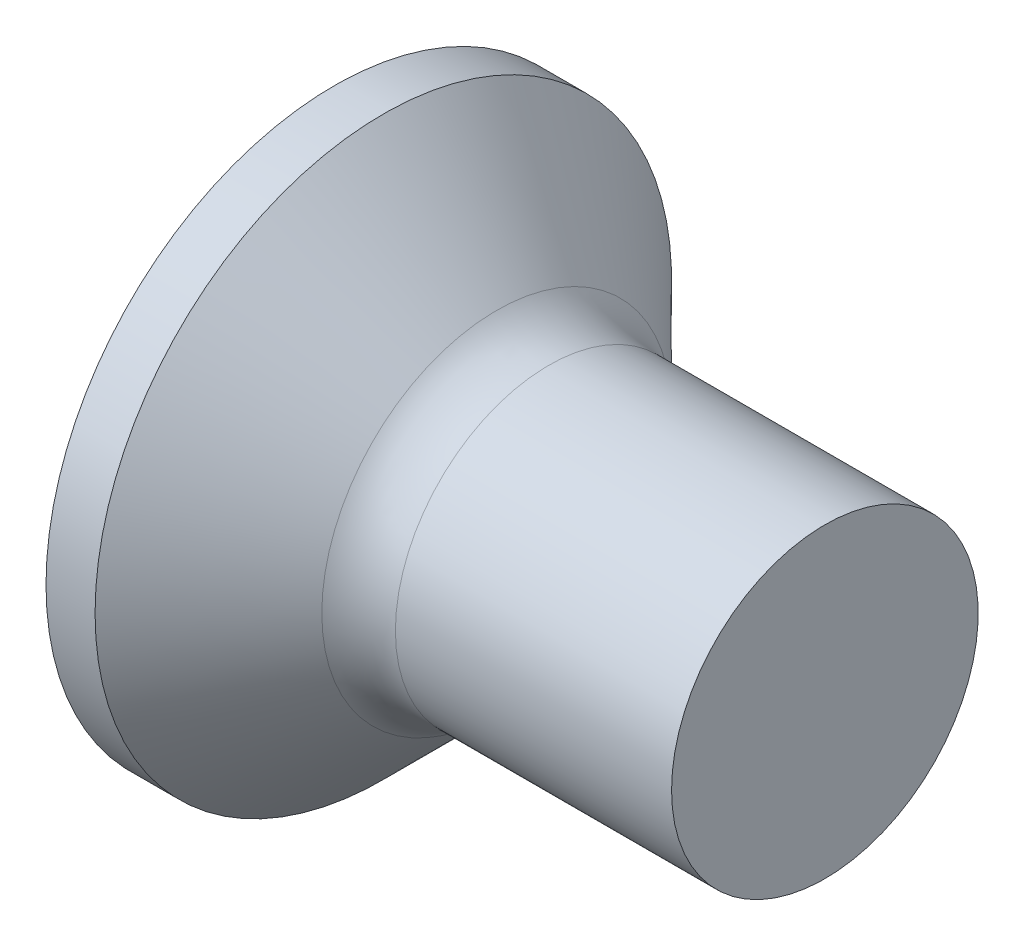
ISO-10303-21;
HEADER;
FILE_DESCRIPTION(('STEP AP214'),'2;1');
FILE_NAME('part.step','',(''),(''),'','','');
FILE_SCHEMA(('AUTOMOTIVE_DESIGN { 1 0 10303 214 1 1 1 1 }'));
ENDSEC;
DATA;
#1=APPLICATION_CONTEXT('core data for automotive mechanical design processes');
#2=APPLICATION_PROTOCOL_DEFINITION('international standard','automotive_design',2000,#1);
#3=PRODUCT_CONTEXT('',#1,'mechanical');
#4=PRODUCT('Part','Part','',(#3));
#5=PRODUCT_RELATED_PRODUCT_CATEGORY('part','',(#4));
#6=PRODUCT_DEFINITION_FORMATION('','',#4);
#7=PRODUCT_DEFINITION_CONTEXT('part definition',#1,'design');
#8=PRODUCT_DEFINITION('design','',#6,#7);
#9=PRODUCT_DEFINITION_SHAPE('','',#8);
#10=(LENGTH_UNIT() NAMED_UNIT(*) SI_UNIT(.MILLI.,.METRE.));
#11=(NAMED_UNIT(*) PLANE_ANGLE_UNIT() SI_UNIT($,.RADIAN.));
#12=(NAMED_UNIT(*) SI_UNIT($,.STERADIAN.) SOLID_ANGLE_UNIT());
#13=UNCERTAINTY_MEASURE_WITH_UNIT(LENGTH_MEASURE(1.E-05),#10,'distance_accuracy_value','');
#14=(GEOMETRIC_REPRESENTATION_CONTEXT(3) GLOBAL_UNCERTAINTY_ASSIGNED_CONTEXT((#13)) GLOBAL_UNIT_ASSIGNED_CONTEXT((#10,
#11,#12)) REPRESENTATION_CONTEXT('',''));
#15=CARTESIAN_POINT('',(0.,0.,0.));
#16=DIRECTION('',(0.,0.,1.));
#17=DIRECTION('',(1.,0.,0.));
#18=AXIS2_PLACEMENT_3D('',#15,#16,#17);
#19=CARTESIAN_POINT('',(1.73,-0.537453962312429,0.37));
#20=DIRECTION('',(0.,0.,-1.));
#21=DIRECTION('',(0.,1.,0.));
#22=AXIS2_PLACEMENT_3D('',#19,#20,#21);
#23=PLANE('',#22);
#24=DIRECTION('',(0.,-1.,0.));
#25=VECTOR('',#24,1.);
#26=CARTESIAN_POINT('',(0.,1.4,0.37));
#27=LINE('',#26,#25);
#28=CARTESIAN_POINT('',(0.,-0.566915305439072,0.37));
#29=VERTEX_POINT('',#28);
#30=CARTESIAN_POINT('',(0.,-1.4,0.37));
#31=VERTEX_POINT('',#30);
#32=EDGE_CURVE('E462',#29,#31,#27,.T.);
#33=ORIENTED_EDGE('',*,*,#32,.F.);
#34=CARTESIAN_POINT('',(-1.01454775314832,-0.649985037380819,0.37));
#35=CARTESIAN_POINT('',(-0.809029839965787,-0.633442085917927,0.37));
#36=CARTESIAN_POINT('',(-0.603523080210379,-0.616757766930615,0.37));
#37=CARTESIAN_POINT('',(-0.192537417897885,-0.582995575513896,0.37));
#38=CARTESIAN_POINT('',(0.0129414839545158,-0.565917694515791,0.37));
#39=CARTESIAN_POINT('',(0.423856873460109,-0.531258276152526,0.37));
#40=CARTESIAN_POINT('',(0.629293361123234,-0.513676738905451,0.37));
#41=CARTESIAN_POINT('',(1.04010430555808,-0.47783288645791,0.37));
#42=CARTESIAN_POINT('',(1.24547876317318,-0.459570580976025,0.37));
#43=CARTESIAN_POINT('',(1.58556056775259,-0.428522827244021,0.37));
#44=CARTESIAN_POINT('',(1.72029296523314,-0.416012545973762,0.37));
#45=CARTESIAN_POINT('',(1.9897048174303,-0.390443058456943,0.37));
#46=CARTESIAN_POINT('',(2.12438427249693,-0.377383855903361,0.37));
#47=CARTESIAN_POINT('',(2.39367840755768,-0.350538593352539,0.37));
#48=CARTESIAN_POINT('',(2.52829308400572,-0.336752497317635,0.37));
#49=CARTESIAN_POINT('',(2.79740865487838,-0.308085247406428,0.37));
#50=CARTESIAN_POINT('',(2.93190954639911,-0.293204066387502,0.37));
#51=CARTESIAN_POINT('',(3.06632904696708,-0.277591273791154,0.37));
#52=B_SPLINE_CURVE_WITH_KNOTS('',3,(#34,#35,#36,#37,#38,#39,#40,#41,#42,#43,#44,#45,#46,#47,#48,
#49,#50,#51),.UNSPECIFIED.,.F.,.F.,(4,2,2,2,2,2,2,2,4),(0.,0.618548221151345,1.23710992218588,
1.85567147819535,2.47422420705856,2.88015918383618,3.28609143004275,3.69204382037103,
4.09800627596968),.UNSPECIFIED.);
#53=CARTESIAN_POINT('',(1.73,-0.415013252800436,0.370000000000001));
#54=VERTEX_POINT('',#53);
#55=EDGE_CURVE('E218',#29,#54,#52,.T.);
#56=ORIENTED_EDGE('',*,*,#55,.T.);
#57=DIRECTION('',(0.,-1.,0.));
#58=VECTOR('',#57,1.);
#59=CARTESIAN_POINT('',(1.73,0.537453962312429,0.37));
#60=LINE('',#59,#58);
#61=CARTESIAN_POINT('',(1.73,-0.537453962312429,0.37));
#62=VERTEX_POINT('',#61);
#63=EDGE_CURVE('E371',#54,#62,#60,.T.);
#64=ORIENTED_EDGE('',*,*,#63,.T.);
#65=DIRECTION('',(0.894934391398442,0.446197753347436,0.));
#66=VECTOR('',#65,1.);
#67=CARTESIAN_POINT('',(0.,-1.4,0.37));
#68=LINE('',#67,#66);
#69=EDGE_CURVE('E470',#31,#62,#68,.T.);
#70=ORIENTED_EDGE('',*,*,#69,.F.);
#71=EDGE_LOOP('',(#33,#56,#64,#70));
#72=FACE_BOUND('',#71,.T.);
#73=ADVANCED_FACE('F39',(#72),#23,.T.);
#74=CARTESIAN_POINT('',(1.73,0.537453962312429,0.37));
#75=VERTEX_POINT('',#74);
#76=CARTESIAN_POINT('',(1.73,0.415013252800436,0.37));
#77=VERTEX_POINT('',#76);
#78=EDGE_CURVE('E367',#75,#77,#60,.T.);
#79=ORIENTED_EDGE('',*,*,#78,.T.);
#80=CARTESIAN_POINT('',(-1.01454775314832,0.649985037380819,0.37));
#81=CARTESIAN_POINT('',(-0.809029839965787,0.633442085917927,0.37));
#82=CARTESIAN_POINT('',(-0.603523080210379,0.616757766930615,0.37));
#83=CARTESIAN_POINT('',(-0.192537417897885,0.582995575513896,0.37));
#84=CARTESIAN_POINT('',(0.0129414839545158,0.565917694515791,0.37));
#85=CARTESIAN_POINT('',(0.423856873460109,0.531258276152526,0.37));
#86=CARTESIAN_POINT('',(0.629293361123234,0.513676738905451,0.37));
#87=CARTESIAN_POINT('',(1.04010430555808,0.47783288645791,0.37));
#88=CARTESIAN_POINT('',(1.24547876317318,0.459570580976025,0.37));
#89=CARTESIAN_POINT('',(1.58556056775259,0.428522827244021,0.37));
#90=CARTESIAN_POINT('',(1.72029296523314,0.416012545973762,0.37));
#91=CARTESIAN_POINT('',(1.9897048174303,0.390443058456943,0.37));
#92=CARTESIAN_POINT('',(2.12438427249693,0.377383855903361,0.37));
#93=CARTESIAN_POINT('',(2.39367840755768,0.350538593352539,0.37));
#94=CARTESIAN_POINT('',(2.52829308400572,0.336752497317635,0.37));
#95=CARTESIAN_POINT('',(2.79740865487838,0.308085247406428,0.37));
#96=CARTESIAN_POINT('',(2.93190954639911,0.293204066387502,0.37));
#97=CARTESIAN_POINT('',(3.06632904696708,0.277591273791154,0.37));
#98=B_SPLINE_CURVE_WITH_KNOTS('',3,(#80,#81,#82,#83,#84,#85,#86,#87,#88,#89,#90,#91,#92,#93,#94,
#95,#96,#97),.UNSPECIFIED.,.F.,.F.,(4,2,2,2,2,2,2,2,4),(0.,0.618548221151345,1.23710992218588,
1.85567147819535,2.47422420705856,2.88015918383618,3.28609143004275,3.69204382037103,
4.09800627596968),.UNSPECIFIED.);
#99=CARTESIAN_POINT('',(0.,0.566915305439072,0.37));
#100=VERTEX_POINT('',#99);
#101=EDGE_CURVE('E211',#77,#100,#98,.F.);
#102=ORIENTED_EDGE('',*,*,#101,.T.);
#103=CARTESIAN_POINT('',(0.,1.4,0.37));
#104=VERTEX_POINT('',#103);
#105=EDGE_CURVE('E464',#104,#100,#27,.T.);
#106=ORIENTED_EDGE('',*,*,#105,.F.);
#107=DIRECTION('',(0.894934391398443,-0.446197753347436,0.));
#108=VECTOR('',#107,1.);
#109=CARTESIAN_POINT('',(0.,1.4,0.37));
#110=LINE('',#109,#108);
#111=EDGE_CURVE('E62',#104,#75,#110,.T.);
#112=ORIENTED_EDGE('',*,*,#111,.T.);
#113=EDGE_LOOP('',(#79,#102,#106,#112));
#114=FACE_BOUND('',#113,.T.);
#115=ADVANCED_FACE('F193',(#114),#23,.T.);
#116=CARTESIAN_POINT('',(1.73,0.537453962312429,-0.37));
#117=DIRECTION('',(0.,0.,1.));
#118=DIRECTION('',(1.,0.,0.));
#119=AXIS2_PLACEMENT_3D('',#116,#117,#118);
#120=PLANE('',#119);
#121=DIRECTION('',(0.,1.,0.));
#122=VECTOR('',#121,1.);
#123=CARTESIAN_POINT('',(1.73,-0.537453962312429,-0.37));
#124=LINE('',#123,#122);
#125=CARTESIAN_POINT('',(1.73,-0.537453962312429,-0.37));
#126=VERTEX_POINT('',#125);
#127=CARTESIAN_POINT('',(1.73,-0.415013252800436,-0.37));
#128=VERTEX_POINT('',#127);
#129=EDGE_CURVE('E380',#126,#128,#124,.T.);
#130=ORIENTED_EDGE('',*,*,#129,.T.);
#131=CARTESIAN_POINT('',(-1.01454775316786,-0.649985037382392,-0.37));
#132=CARTESIAN_POINT('',(-0.809029839983234,-0.63344208591934,-0.37));
#133=CARTESIAN_POINT('',(-0.603523080225735,-0.616757766931868,-0.37));
#134=CARTESIAN_POINT('',(-0.192537417909059,-0.582995575514823,-0.37));
#135=CARTESIAN_POINT('',(0.0129414839454312,-0.565917694516552,-0.37));
#136=CARTESIAN_POINT('',(0.4238568734577,-0.531258276152735,-0.37));
#137=CARTESIAN_POINT('',(0.62929336112541,-0.513676738905269,-0.37));
#138=CARTESIAN_POINT('',(1.04010430556943,-0.477832886456913,-0.37));
#139=CARTESIAN_POINT('',(1.2454787631891,-0.459570580974604,-0.37));
#140=CARTESIAN_POINT('',(1.58556056777309,-0.428522827242128,-0.37));
#141=CARTESIAN_POINT('',(1.72029296525365,-0.416012545971845,-0.37));
#142=CARTESIAN_POINT('',(1.9897048174508,-0.39044305845497,-0.37));
#143=CARTESIAN_POINT('',(2.12438427251743,-0.377383855901355,-0.37));
#144=CARTESIAN_POINT('',(2.39367840757817,-0.350538593350458,-0.37));
#145=CARTESIAN_POINT('',(2.52829308402621,-0.33675249731551,-0.37));
#146=CARTESIAN_POINT('',(2.79740865489886,-0.308085247404194,-0.37));
#147=CARTESIAN_POINT('',(2.93190954641958,-0.293204066385202,-0.37));
#148=CARTESIAN_POINT('',(3.06632904698754,-0.27759127378877,-0.37));
#149=B_SPLINE_CURVE_WITH_KNOTS('',3,(#131,#132,#133,#134,#135,#136,#137,#138,#139,#140,#141,
#142,#143,#144,#145,#146,#147,#148),.UNSPECIFIED.,.F.,.F.,(4,2,2,2,2,2,2,2,4),(0.,
0.618548221157635,1.23710992219846,1.85567147822173,2.47422420709875,2.88015918387637,
3.28609143008294,3.69204382041122,4.09800627600988),.UNSPECIFIED.);
#150=CARTESIAN_POINT('',(0.,-0.566915305439072,-0.37));
#151=VERTEX_POINT('',#150);
#152=EDGE_CURVE('E274',#128,#151,#149,.F.);
#153=ORIENTED_EDGE('',*,*,#152,.T.);
#154=DIRECTION('',(0.,1.,0.));
#155=VECTOR('',#154,1.);
#156=CARTESIAN_POINT('',(0.,-1.4,-0.37));
#157=LINE('',#156,#155);
#158=CARTESIAN_POINT('',(0.,-1.4,-0.37));
#159=VERTEX_POINT('',#158);
#160=EDGE_CURVE('E463',#159,#151,#157,.T.);
#161=ORIENTED_EDGE('',*,*,#160,.F.);
#162=DIRECTION('',(0.894934391398442,0.446197753347436,0.));
#163=VECTOR('',#162,1.);
#164=CARTESIAN_POINT('',(0.,-1.4,-0.37));
#165=LINE('',#164,#163);
#166=EDGE_CURVE('E473',#159,#126,#165,.T.);
#167=ORIENTED_EDGE('',*,*,#166,.T.);
#168=EDGE_LOOP('',(#130,#153,#161,#167));
#169=FACE_BOUND('',#168,.T.);
#170=ADVANCED_FACE('F199',(#169),#120,.T.);
#171=CARTESIAN_POINT('',(0.,0.566915305439072,-0.37));
#172=VERTEX_POINT('',#171);
#173=CARTESIAN_POINT('',(0.,1.4,-0.37));
#174=VERTEX_POINT('',#173);
#175=EDGE_CURVE('E469',#172,#174,#157,.T.);
#176=ORIENTED_EDGE('',*,*,#175,.F.);
#177=CARTESIAN_POINT('',(-1.01454775316786,0.649985037382392,-0.37));
#178=CARTESIAN_POINT('',(-0.809029839983234,0.63344208591934,-0.37));
#179=CARTESIAN_POINT('',(-0.603523080225735,0.616757766931868,-0.37));
#180=CARTESIAN_POINT('',(-0.192537417909059,0.582995575514823,-0.37));
#181=CARTESIAN_POINT('',(0.0129414839454312,0.565917694516552,-0.37));
#182=CARTESIAN_POINT('',(0.4238568734577,0.531258276152735,-0.37));
#183=CARTESIAN_POINT('',(0.62929336112541,0.513676738905269,-0.37));
#184=CARTESIAN_POINT('',(1.04010430556943,0.477832886456913,-0.37));
#185=CARTESIAN_POINT('',(1.2454787631891,0.459570580974604,-0.37));
#186=CARTESIAN_POINT('',(1.58556056777309,0.428522827242128,-0.37));
#187=CARTESIAN_POINT('',(1.72029296525365,0.416012545971845,-0.37));
#188=CARTESIAN_POINT('',(1.9897048174508,0.39044305845497,-0.37));
#189=CARTESIAN_POINT('',(2.12438427251743,0.377383855901355,-0.37));
#190=CARTESIAN_POINT('',(2.39367840757817,0.350538593350458,-0.37));
#191=CARTESIAN_POINT('',(2.52829308402621,0.33675249731551,-0.37));
#192=CARTESIAN_POINT('',(2.79740865489886,0.308085247404194,-0.37));
#193=CARTESIAN_POINT('',(2.93190954641958,0.293204066385202,-0.37));
#194=CARTESIAN_POINT('',(3.06632904698754,0.27759127378877,-0.37));
#195=B_SPLINE_CURVE_WITH_KNOTS('',3,(#177,#178,#179,#180,#181,#182,#183,#184,#185,#186,#187,
#188,#189,#190,#191,#192,#193,#194),.UNSPECIFIED.,.F.,.F.,(4,2,2,2,2,2,2,2,4),(0.,
0.618548221157635,1.23710992219846,1.85567147822173,2.47422420709875,2.88015918387637,
3.28609143008294,3.69204382041122,4.09800627600988),.UNSPECIFIED.);
#196=CARTESIAN_POINT('',(1.73,0.415013252800436,-0.37));
#197=VERTEX_POINT('',#196);
#198=EDGE_CURVE('E268',#172,#197,#195,.T.);
#199=ORIENTED_EDGE('',*,*,#198,.T.);
#200=CARTESIAN_POINT('',(1.73,0.53745396231243,-0.37));
#201=VERTEX_POINT('',#200);
#202=EDGE_CURVE('E382',#197,#201,#124,.T.);
#203=ORIENTED_EDGE('',*,*,#202,.T.);
#204=DIRECTION('',(0.894934391398442,-0.446197753347436,0.));
#205=VECTOR('',#204,1.);
#206=CARTESIAN_POINT('',(0.,1.4,-0.37));
#207=LINE('',#206,#205);
#208=EDGE_CURVE('E379',#174,#201,#207,.T.);
#209=ORIENTED_EDGE('',*,*,#208,.F.);
#210=EDGE_LOOP('',(#176,#199,#203,#209));
#211=FACE_BOUND('',#210,.T.);
#212=ADVANCED_FACE('F480',(#211),#120,.T.);
#213=CARTESIAN_POINT('',(1.73,0.537453962312429,-0.37));
#214=DIRECTION('',(1.,0.,0.));
#215=DIRECTION('',(0.,0.,-1.));
#216=AXIS2_PLACEMENT_3D('',#213,#214,#215);
#217=PLANE('',#216);
#218=CARTESIAN_POINT('',(1.73,0.,0.));
#219=DIRECTION('',(-1.,0.,0.));
#220=DIRECTION('',(0.,0.,1.));
#221=AXIS2_PLACEMENT_3D('',#218,#219,#220);
#222=CIRCLE('',#221,0.555999999999999);
#223=CARTESIAN_POINT('',(1.73,-0.142405190897905,-0.53745396231243));
#224=VERTEX_POINT('',#223);
#225=CARTESIAN_POINT('',(1.73,-0.369999999999999,-0.415013252800438));
#226=VERTEX_POINT('',#225);
#227=EDGE_CURVE('E346',#224,#226,#222,.T.);
#228=ORIENTED_EDGE('',*,*,#227,.F.);
#229=DIRECTION('',(0.,1.,0.));
#230=VECTOR('',#229,1.);
#231=CARTESIAN_POINT('',(1.73,-0.369999999999998,-0.53745396231243));
#232=LINE('',#231,#230);
#233=CARTESIAN_POINT('',(1.73,-0.369999999999998,-0.53745396231243));
#234=VERTEX_POINT('',#233);
#235=EDGE_CURVE('E447',#234,#224,#232,.T.);
#236=ORIENTED_EDGE('',*,*,#235,.F.);
#237=DIRECTION('',(0.,0.,-1.));
#238=VECTOR('',#237,1.);
#239=CARTESIAN_POINT('',(1.73,-0.370000000000002,0.537453962312428));
#240=LINE('',#239,#238);
#241=EDGE_CURVE('E451',#226,#234,#240,.T.);
#242=ORIENTED_EDGE('',*,*,#241,.F.);
#243=EDGE_LOOP('',(#228,#236,#242));
#244=FACE_BOUND('',#243,.T.);
#245=ADVANCED_FACE('F493',(#244),#217,.F.);
#246=CARTESIAN_POINT('',(1.73,-0.537453962312429,-0.142405190897907));
#247=VERTEX_POINT('',#246);
#248=EDGE_CURVE('E341',#128,#247,#222,.T.);
#249=ORIENTED_EDGE('',*,*,#248,.F.);
#250=ORIENTED_EDGE('',*,*,#129,.F.);
#251=DIRECTION('',(0.,0.,-1.));
#252=VECTOR('',#251,1.);
#253=CARTESIAN_POINT('',(1.73,-0.537453962312429,0.37));
#254=LINE('',#253,#252);
#255=EDGE_CURVE('E370',#247,#126,#254,.T.);
#256=ORIENTED_EDGE('',*,*,#255,.F.);
#257=EDGE_LOOP('',(#249,#250,#256));
#258=FACE_BOUND('',#257,.T.);
#259=ADVANCED_FACE('F499',(#258),#217,.F.);
#260=CARTESIAN_POINT('',(1.73,-0.537453962312429,0.142405190897907));
#261=VERTEX_POINT('',#260);
#262=EDGE_CURVE('E336',#261,#54,#222,.T.);
#263=ORIENTED_EDGE('',*,*,#262,.F.);
#264=EDGE_CURVE('E373',#62,#261,#254,.T.);
#265=ORIENTED_EDGE('',*,*,#264,.F.);
#266=ORIENTED_EDGE('',*,*,#63,.F.);
#267=EDGE_LOOP('',(#263,#265,#266));
#268=FACE_BOUND('',#267,.T.);
#269=ADVANCED_FACE('F505',(#268),#217,.F.);
#270=CARTESIAN_POINT('',(1.73,-0.370000000000001,0.415013252800436));
#271=VERTEX_POINT('',#270);
#272=CARTESIAN_POINT('',(1.73,-0.142405190897905,0.537453962312429));
#273=VERTEX_POINT('',#272);
#274=EDGE_CURVE('E54',#271,#273,#222,.T.);
#275=ORIENTED_EDGE('',*,*,#274,.F.);
#276=CARTESIAN_POINT('',(1.73,-0.370000000000002,0.537453962312428));
#277=VERTEX_POINT('',#276);
#278=EDGE_CURVE('E453',#277,#271,#240,.T.);
#279=ORIENTED_EDGE('',*,*,#278,.F.);
#280=DIRECTION('',(0.,-1.,0.));
#281=VECTOR('',#280,1.);
#282=CARTESIAN_POINT('',(1.73,0.369999999999998,0.537453962312431));
#283=LINE('',#282,#281);
#284=EDGE_CURVE('E452',#273,#277,#283,.T.);
#285=ORIENTED_EDGE('',*,*,#284,.F.);
#286=EDGE_LOOP('',(#275,#279,#285));
#287=FACE_BOUND('',#286,.T.);
#288=ADVANCED_FACE('F532',(#287),#217,.F.);
#289=CARTESIAN_POINT('',(1.73,0.142405190897903,0.53745396231243));
#290=VERTEX_POINT('',#289);
#291=CARTESIAN_POINT('',(1.73,0.369999999999999,0.415013252800438));
#292=VERTEX_POINT('',#291);
#293=EDGE_CURVE('E327',#290,#292,#222,.T.);
#294=ORIENTED_EDGE('',*,*,#293,.F.);
#295=CARTESIAN_POINT('',(1.73,0.369999999999998,0.537453962312431));
#296=VERTEX_POINT('',#295);
#297=EDGE_CURVE('E448',#296,#290,#283,.T.);
#298=ORIENTED_EDGE('',*,*,#297,.F.);
#299=DIRECTION('',(0.,0.,1.));
#300=VECTOR('',#299,1.);
#301=CARTESIAN_POINT('',(1.73,0.370000000000002,-0.537453962312428));
#302=LINE('',#301,#300);
#303=EDGE_CURVE('E225',#292,#296,#302,.T.);
#304=ORIENTED_EDGE('',*,*,#303,.F.);
#305=EDGE_LOOP('',(#294,#298,#304));
#306=FACE_BOUND('',#305,.T.);
#307=ADVANCED_FACE('F489',(#306),#217,.F.);
#308=CARTESIAN_POINT('',(1.73,0.53745396231243,0.142405190897905));
#309=VERTEX_POINT('',#308);
#310=EDGE_CURVE('E334',#77,#309,#222,.T.);
#311=ORIENTED_EDGE('',*,*,#310,.F.);
#312=ORIENTED_EDGE('',*,*,#78,.F.);
#313=DIRECTION('',(0.,0.,1.));
#314=VECTOR('',#313,1.);
#315=CARTESIAN_POINT('',(1.73,0.537453962312429,-0.37));
#316=LINE('',#315,#314);
#317=EDGE_CURVE('E368',#309,#75,#316,.T.);
#318=ORIENTED_EDGE('',*,*,#317,.F.);
#319=EDGE_LOOP('',(#311,#312,#318));
#320=FACE_BOUND('',#319,.T.);
#321=ADVANCED_FACE('F366',(#320),#217,.F.);
#322=CARTESIAN_POINT('',(1.73,0.53745396231243,-0.142405190897905));
#323=VERTEX_POINT('',#322);
#324=EDGE_CURVE('E356',#323,#197,#222,.T.);
#325=ORIENTED_EDGE('',*,*,#324,.F.);
#326=EDGE_CURVE('E375',#201,#323,#316,.T.);
#327=ORIENTED_EDGE('',*,*,#326,.F.);
#328=ORIENTED_EDGE('',*,*,#202,.F.);
#329=EDGE_LOOP('',(#325,#327,#328));
#330=FACE_BOUND('',#329,.T.);
#331=ADVANCED_FACE('F482',(#330),#217,.F.);
#332=CARTESIAN_POINT('',(1.73,-0.537453962312429,-0.37));
#333=DIRECTION('',(-0.446197753347436,0.894934391398443,0.));
#334=DIRECTION('',(-0.894934391398442,-0.446197753347436,0.));
#335=AXIS2_PLACEMENT_3D('',#332,#333,#334);
#336=PLANE('',#335);
#337=ORIENTED_EDGE('',*,*,#264,.T.);
#338=CARTESIAN_POINT('',(2.6700539918433,-0.068760409782475,0.));
#339=DIRECTION('',(-0.446197753347436,0.894934391398443,0.));
#340=DIRECTION('',(-0.894934391398443,-0.446197753347436,0.));
#341=AXIS2_PLACEMENT_3D('',#338,#339,#340);
#342=ELLIPSE('',#341,1.09876174323515,0.485419197346535);
#343=EDGE_CURVE('E286',#261,#247,#342,.F.);
#344=ORIENTED_EDGE('',*,*,#343,.T.);
#345=ORIENTED_EDGE('',*,*,#255,.T.);
#346=ORIENTED_EDGE('',*,*,#166,.F.);
#347=DIRECTION('',(0.,0.,-1.));
#348=VECTOR('',#347,1.);
#349=CARTESIAN_POINT('',(0.,-1.4,0.37));
#350=LINE('',#349,#348);
#351=EDGE_CURVE('E387',#31,#159,#350,.T.);
#352=ORIENTED_EDGE('',*,*,#351,.F.);
#353=ORIENTED_EDGE('',*,*,#69,.T.);
#354=EDGE_LOOP('',(#337,#344,#345,#346,#352,#353));
#355=FACE_BOUND('',#354,.T.);
#356=ADVANCED_FACE('F205',(#355),#336,.T.);
#357=CARTESIAN_POINT('',(1.73,0.537453962312429,0.37));
#358=DIRECTION('',(-0.446197753347436,-0.894934391398443,0.));
#359=DIRECTION('',(0.894934391398443,-0.446197753347436,0.));
#360=AXIS2_PLACEMENT_3D('',#357,#358,#359);
#361=PLANE('',#360);
#362=ORIENTED_EDGE('',*,*,#326,.T.);
#363=CARTESIAN_POINT('',(2.6700539918433,0.0687604097824753,0.));
#364=DIRECTION('',(-0.446197753347436,-0.894934391398443,0.));
#365=DIRECTION('',(-0.894934391398443,0.446197753347436,0.));
#366=AXIS2_PLACEMENT_3D('',#363,#364,#365);
#367=ELLIPSE('',#366,1.09876174323515,0.485419197346535);
#368=EDGE_CURVE('E291',#323,#309,#367,.F.);
#369=ORIENTED_EDGE('',*,*,#368,.T.);
#370=ORIENTED_EDGE('',*,*,#317,.T.);
#371=ORIENTED_EDGE('',*,*,#111,.F.);
#372=DIRECTION('',(0.,0.,1.));
#373=VECTOR('',#372,1.);
#374=CARTESIAN_POINT('',(0.,1.4,-0.37));
#375=LINE('',#374,#373);
#376=EDGE_CURVE('E459',#174,#104,#375,.T.);
#377=ORIENTED_EDGE('',*,*,#376,.F.);
#378=ORIENTED_EDGE('',*,*,#208,.T.);
#379=EDGE_LOOP('',(#362,#369,#370,#371,#377,#378));
#380=FACE_BOUND('',#379,.T.);
#381=ADVANCED_FACE('F478',(#380),#361,.T.);
#382=CARTESIAN_POINT('',(1.73,0.369999999999998,0.537453962312431));
#383=DIRECTION('',(0.,-1.,0.));
#384=DIRECTION('',(1.,0.,0.));
#385=AXIS2_PLACEMENT_3D('',#382,#383,#384);
#386=PLANE('',#385);
#387=CARTESIAN_POINT('',(1.73,0.370000000000002,-0.537453962312428));
#388=VERTEX_POINT('',#387);
#389=CARTESIAN_POINT('',(1.73,0.370000000000001,-0.415013252800436));
#390=VERTEX_POINT('',#389);
#391=EDGE_CURVE('E457',#388,#390,#302,.T.);
#392=ORIENTED_EDGE('',*,*,#391,.T.);
#393=CARTESIAN_POINT('',(-1.01454775314832,0.370000000000002,-0.649985037380818));
#394=CARTESIAN_POINT('',(-0.809029839965788,0.370000000000002,-0.633442085917926));
#395=CARTESIAN_POINT('',(-0.60352308021038,0.370000000000002,-0.616757766930614));
#396=CARTESIAN_POINT('',(-0.192537417897885,0.370000000000002,-0.582995575513895));
#397=CARTESIAN_POINT('',(0.0129414839545158,0.370000000000002,-0.56591769451579));
#398=CARTESIAN_POINT('',(0.423856873460108,0.370000000000002,-0.531258276152525));
#399=CARTESIAN_POINT('',(0.629293361123234,0.370000000000002,-0.51367673890545));
#400=CARTESIAN_POINT('',(1.04010430555808,0.370000000000001,-0.477832886457909));
#401=CARTESIAN_POINT('',(1.24547876317318,0.370000000000001,-0.459570580976024));
#402=CARTESIAN_POINT('',(1.58556056775259,0.370000000000001,-0.42852282724402));
#403=CARTESIAN_POINT('',(1.72029296523314,0.370000000000001,-0.416012545973761));
#404=CARTESIAN_POINT('',(1.9897048174303,0.370000000000001,-0.390443058456942));
#405=CARTESIAN_POINT('',(2.12438427249693,0.370000000000001,-0.377383855903359));
#406=CARTESIAN_POINT('',(2.39367840755768,0.370000000000001,-0.350538593352537));
#407=CARTESIAN_POINT('',(2.52829308400572,0.370000000000001,-0.336752497317634));
#408=CARTESIAN_POINT('',(2.79740865487838,0.370000000000001,-0.308085247406427));
#409=CARTESIAN_POINT('',(2.93190954639911,0.370000000000001,-0.293204066387501));
#410=CARTESIAN_POINT('',(3.06632904696708,0.370000000000001,-0.277591273791153));
#411=B_SPLINE_CURVE_WITH_KNOTS('',3,(#393,#394,#395,#396,#397,#398,#399,#400,#401,#402,#403,
#404,#405,#406,#407,#408,#409,#410),.UNSPECIFIED.,.F.,.F.,(4,2,2,2,2,2,2,2,4),(0.,
0.618548221151345,1.23710992218588,1.85567147819535,2.47422420705856,2.88015918383618,
3.28609143004275,3.69204382037103,4.09800627596968),.UNSPECIFIED.);
#412=CARTESIAN_POINT('',(0.,0.370000000000002,-0.566915305439071));
#413=VERTEX_POINT('',#412);
#414=EDGE_CURVE('E260',#390,#413,#411,.F.);
#415=ORIENTED_EDGE('',*,*,#414,.T.);
#416=DIRECTION('',(0.,0.,1.));
#417=VECTOR('',#416,1.);
#418=CARTESIAN_POINT('',(0.,0.370000000000005,-1.4));
#419=LINE('',#418,#417);
#420=CARTESIAN_POINT('',(0.,0.370000000000005,-1.4));
#421=VERTEX_POINT('',#420);
#422=EDGE_CURVE('E433',#421,#413,#419,.T.);
#423=ORIENTED_EDGE('',*,*,#422,.F.);
#424=DIRECTION('',(0.894934391398442,0.,0.446197753347436));
#425=VECTOR('',#424,1.);
#426=CARTESIAN_POINT('',(0.,0.370000000000005,-1.4));
#427=LINE('',#426,#425);
#428=EDGE_CURVE('E439',#421,#388,#427,.T.);
#429=ORIENTED_EDGE('',*,*,#428,.T.);
#430=EDGE_LOOP('',(#392,#415,#423,#429));
#431=FACE_BOUND('',#430,.T.);
#432=ADVANCED_FACE('F612',(#431),#386,.T.);
#433=CARTESIAN_POINT('',(1.73,-0.369999999999998,-0.53745396231243));
#434=DIRECTION('',(0.,1.,0.));
#435=DIRECTION('',(0.,0.,1.));
#436=AXIS2_PLACEMENT_3D('',#433,#434,#435);
#437=PLANE('',#436);
#438=DIRECTION('',(0.,0.,-1.));
#439=VECTOR('',#438,1.);
#440=CARTESIAN_POINT('',(0.,-0.370000000000005,1.4));
#441=LINE('',#440,#439);
#442=CARTESIAN_POINT('',(0.,-0.369999999999998,-0.566915305439073));
#443=VERTEX_POINT('',#442);
#444=CARTESIAN_POINT('',(0.,-0.369999999999995,-1.4));
#445=VERTEX_POINT('',#444);
#446=EDGE_CURVE('E429',#443,#445,#441,.T.);
#447=ORIENTED_EDGE('',*,*,#446,.F.);
#448=CARTESIAN_POINT('',(-1.01454775316786,-0.369999999999998,-0.649985037382392));
#449=CARTESIAN_POINT('',(-0.809029839983234,-0.369999999999998,-0.633442085919341));
#450=CARTESIAN_POINT('',(-0.603523080225735,-0.369999999999998,-0.616757766931869));
#451=CARTESIAN_POINT('',(-0.192537417909059,-0.369999999999998,-0.582995575514824));
#452=CARTESIAN_POINT('',(0.0129414839454314,-0.369999999999998,-0.565917694516553));
#453=CARTESIAN_POINT('',(0.4238568734577,-0.369999999999998,-0.531258276152736));
#454=CARTESIAN_POINT('',(0.62929336112541,-0.369999999999998,-0.51367673890527));
#455=CARTESIAN_POINT('',(1.04010430556943,-0.369999999999998,-0.477832886456914));
#456=CARTESIAN_POINT('',(1.2454787631891,-0.369999999999998,-0.459570580974605));
#457=CARTESIAN_POINT('',(1.58556056777309,-0.369999999999999,-0.428522827242129));
#458=CARTESIAN_POINT('',(1.72029296525365,-0.369999999999999,-0.416012545971846));
#459=CARTESIAN_POINT('',(1.9897048174508,-0.369999999999999,-0.390443058454971));
#460=CARTESIAN_POINT('',(2.12438427251743,-0.369999999999999,-0.377383855901356));
#461=CARTESIAN_POINT('',(2.39367840757817,-0.369999999999999,-0.350538593350459));
#462=CARTESIAN_POINT('',(2.52829308402621,-0.369999999999999,-0.336752497315511));
#463=CARTESIAN_POINT('',(2.79740865489886,-0.369999999999999,-0.308085247404195));
#464=CARTESIAN_POINT('',(2.93190954641958,-0.369999999999999,-0.293204066385203));
#465=CARTESIAN_POINT('',(3.06632904698754,-0.369999999999999,-0.277591273788772));
#466=B_SPLINE_CURVE_WITH_KNOTS('',3,(#448,#449,#450,#451,#452,#453,#454,#455,#456,#457,#458,
#459,#460,#461,#462,#463,#464,#465),.UNSPECIFIED.,.F.,.F.,(4,2,2,2,2,2,2,2,4),(0.,
0.618548221157635,1.23710992219846,1.85567147822173,2.47422420709875,2.88015918387637,
3.28609143008294,3.69204382041122,4.09800627600988),.UNSPECIFIED.);
#467=EDGE_CURVE('E253',#443,#226,#466,.T.);
#468=ORIENTED_EDGE('',*,*,#467,.T.);
#469=ORIENTED_EDGE('',*,*,#241,.T.);
#470=DIRECTION('',(0.894934391398442,0.,0.446197753347436));
#471=VECTOR('',#470,1.);
#472=CARTESIAN_POINT('',(0.,-0.369999999999995,-1.4));
#473=LINE('',#472,#471);
#474=EDGE_CURVE('E436',#445,#234,#473,.T.);
#475=ORIENTED_EDGE('',*,*,#474,.F.);
#476=EDGE_LOOP('',(#447,#468,#469,#475));
#477=FACE_BOUND('',#476,.T.);
#478=ADVANCED_FACE('F510',(#477),#437,.T.);
#479=CARTESIAN_POINT('',(1.73,0.370000000000002,-0.537453962312428));
#480=DIRECTION('',(-0.446197753347436,0.,0.894934391398443));
#481=DIRECTION('',(-0.894934391398442,0.,-0.446197753347436));
#482=AXIS2_PLACEMENT_3D('',#479,#480,#481);
#483=PLANE('',#482);
#484=ORIENTED_EDGE('',*,*,#235,.T.);
#485=CARTESIAN_POINT('',(2.6700539918433,0.,-0.068760409782475));
#486=DIRECTION('',(-0.446197753347436,0.,0.894934391398443));
#487=DIRECTION('',(-0.894934391398443,0.,-0.446197753347436));
#488=AXIS2_PLACEMENT_3D('',#485,#486,#487);
#489=ELLIPSE('',#488,1.09876174323515,0.485419197346535);
#490=CARTESIAN_POINT('',(1.73,0.142405190897909,-0.537453962312429));
#491=VERTEX_POINT('',#490);
#492=EDGE_CURVE('E304',#224,#491,#489,.F.);
#493=ORIENTED_EDGE('',*,*,#492,.T.);
#494=EDGE_CURVE('E455',#491,#388,#232,.T.);
#495=ORIENTED_EDGE('',*,*,#494,.T.);
#496=ORIENTED_EDGE('',*,*,#428,.F.);
#497=DIRECTION('',(0.,1.,0.));
#498=VECTOR('',#497,1.);
#499=CARTESIAN_POINT('',(0.,-0.369999999999995,-1.4));
#500=LINE('',#499,#498);
#501=EDGE_CURVE('E428',#445,#421,#500,.T.);
#502=ORIENTED_EDGE('',*,*,#501,.F.);
#503=ORIENTED_EDGE('',*,*,#474,.T.);
#504=EDGE_LOOP('',(#484,#493,#495,#496,#502,#503));
#505=FACE_BOUND('',#504,.T.);
#506=ADVANCED_FACE('F230',(#505),#483,.T.);
#507=ORIENTED_EDGE('',*,*,#278,.T.);
#508=CARTESIAN_POINT('',(-1.01454775314832,-0.370000000000002,0.649985037380818));
#509=CARTESIAN_POINT('',(-0.809029839965788,-0.370000000000002,0.633442085917926));
#510=CARTESIAN_POINT('',(-0.60352308021038,-0.370000000000002,0.616757766930614));
#511=CARTESIAN_POINT('',(-0.192537417897885,-0.370000000000002,0.582995575513895));
#512=CARTESIAN_POINT('',(0.0129414839545157,-0.370000000000002,0.56591769451579));
#513=CARTESIAN_POINT('',(0.423856873460108,-0.370000000000002,0.531258276152525));
#514=CARTESIAN_POINT('',(0.629293361123234,-0.370000000000002,0.51367673890545));
#515=CARTESIAN_POINT('',(1.04010430555808,-0.370000000000002,0.477832886457909));
#516=CARTESIAN_POINT('',(1.24547876317318,-0.370000000000002,0.459570580976024));
#517=CARTESIAN_POINT('',(1.58556056775259,-0.370000000000001,0.42852282724402));
#518=CARTESIAN_POINT('',(1.72029296523314,-0.370000000000001,0.416012545973761));
#519=CARTESIAN_POINT('',(1.9897048174303,-0.370000000000001,0.390443058456942));
#520=CARTESIAN_POINT('',(2.12438427249693,-0.370000000000001,0.377383855903359));
#521=CARTESIAN_POINT('',(2.39367840755768,-0.370000000000001,0.350538593352538));
#522=CARTESIAN_POINT('',(2.52829308400572,-0.370000000000001,0.336752497317634));
#523=CARTESIAN_POINT('',(2.79740865487838,-0.370000000000001,0.308085247406427));
#524=CARTESIAN_POINT('',(2.93190954639911,-0.370000000000001,0.293204066387501));
#525=CARTESIAN_POINT('',(3.06632904696708,-0.370000000000001,0.277591273791153));
#526=B_SPLINE_CURVE_WITH_KNOTS('',3,(#508,#509,#510,#511,#512,#513,#514,#515,#516,#517,#518,
#519,#520,#521,#522,#523,#524,#525),.UNSPECIFIED.,.F.,.F.,(4,2,2,2,2,2,2,2,4),(0.,
0.618548221151345,1.23710992218588,1.85567147819535,2.47422420705856,2.88015918383618,
3.28609143004275,3.69204382037103,4.09800627596968),.UNSPECIFIED.);
#527=CARTESIAN_POINT('',(0.,-0.370000000000002,0.566915305439071));
#528=VERTEX_POINT('',#527);
#529=EDGE_CURVE('E245',#271,#528,#526,.F.);
#530=ORIENTED_EDGE('',*,*,#529,.T.);
#531=CARTESIAN_POINT('',(0.,-0.370000000000005,1.4));
#532=VERTEX_POINT('',#531);
#533=EDGE_CURVE('E424',#532,#528,#441,.T.);
#534=ORIENTED_EDGE('',*,*,#533,.F.);
#535=DIRECTION('',(0.894934391398443,0.,-0.446197753347436));
#536=VECTOR('',#535,1.);
#537=CARTESIAN_POINT('',(0.,-0.370000000000005,1.4));
#538=LINE('',#537,#536);
#539=EDGE_CURVE('E442',#532,#277,#538,.T.);
#540=ORIENTED_EDGE('',*,*,#539,.T.);
#541=EDGE_LOOP('',(#507,#530,#534,#540));
#542=FACE_BOUND('',#541,.T.);
#543=ADVANCED_FACE('F530',(#542),#437,.T.);
#544=CARTESIAN_POINT('',(0.,0.369999999999998,0.566915305439073));
#545=VERTEX_POINT('',#544);
#546=CARTESIAN_POINT('',(0.,0.369999999999995,1.4));
#547=VERTEX_POINT('',#546);
#548=EDGE_CURVE('E435',#545,#547,#419,.T.);
#549=ORIENTED_EDGE('',*,*,#548,.F.);
#550=CARTESIAN_POINT('',(-1.01454775316786,0.369999999999997,0.649985037382393));
#551=CARTESIAN_POINT('',(-0.809029839983234,0.369999999999997,0.633442085919342));
#552=CARTESIAN_POINT('',(-0.603523080225735,0.369999999999997,0.616757766931869));
#553=CARTESIAN_POINT('',(-0.192537417909059,0.369999999999998,0.582995575514824));
#554=CARTESIAN_POINT('',(0.0129414839454315,0.369999999999998,0.565917694516553));
#555=CARTESIAN_POINT('',(0.4238568734577,0.369999999999998,0.531258276152736));
#556=CARTESIAN_POINT('',(0.62929336112541,0.369999999999998,0.51367673890527));
#557=CARTESIAN_POINT('',(1.04010430556943,0.369999999999998,0.477832886456914));
#558=CARTESIAN_POINT('',(1.2454787631891,0.369999999999998,0.459570580974605));
#559=CARTESIAN_POINT('',(1.58556056777309,0.369999999999998,0.428522827242129));
#560=CARTESIAN_POINT('',(1.72029296525365,0.369999999999999,0.416012545971846));
#561=CARTESIAN_POINT('',(1.9897048174508,0.369999999999999,0.390443058454971));
#562=CARTESIAN_POINT('',(2.12438427251743,0.369999999999999,0.377383855901356));
#563=CARTESIAN_POINT('',(2.39367840757817,0.369999999999999,0.350538593350459));
#564=CARTESIAN_POINT('',(2.52829308402621,0.369999999999999,0.336752497315511));
#565=CARTESIAN_POINT('',(2.79740865489886,0.369999999999999,0.308085247404195));
#566=CARTESIAN_POINT('',(2.93190954641958,0.369999999999999,0.293204066385203));
#567=CARTESIAN_POINT('',(3.06632904698754,0.369999999999999,0.277591273788771));
#568=B_SPLINE_CURVE_WITH_KNOTS('',3,(#550,#551,#552,#553,#554,#555,#556,#557,#558,#559,#560,
#561,#562,#563,#564,#565,#566,#567),.UNSPECIFIED.,.F.,.F.,(4,2,2,2,2,2,2,2,4),(0.,
0.618548221157635,1.23710992219846,1.85567147822173,2.47422420709875,2.88015918387637,
3.28609143008294,3.69204382041122,4.09800627600988),.UNSPECIFIED.);
#569=EDGE_CURVE('E235',#545,#292,#568,.T.);
#570=ORIENTED_EDGE('',*,*,#569,.T.);
#571=ORIENTED_EDGE('',*,*,#303,.T.);
#572=DIRECTION('',(0.894934391398442,0.,-0.446197753347436));
#573=VECTOR('',#572,1.);
#574=CARTESIAN_POINT('',(0.,0.369999999999995,1.4));
#575=LINE('',#574,#573);
#576=EDGE_CURVE('E444',#547,#296,#575,.T.);
#577=ORIENTED_EDGE('',*,*,#576,.F.);
#578=EDGE_LOOP('',(#549,#570,#571,#577));
#579=FACE_BOUND('',#578,.T.);
#580=ADVANCED_FACE('F525',(#579),#386,.T.);
#581=CARTESIAN_POINT('',(1.73,-0.370000000000002,0.537453962312428));
#582=DIRECTION('',(-0.446197753347436,0.,-0.894934391398443));
#583=DIRECTION('',(0.894934391398443,0.,-0.446197753347436));
#584=AXIS2_PLACEMENT_3D('',#581,#582,#583);
#585=PLANE('',#584);
#586=ORIENTED_EDGE('',*,*,#297,.T.);
#587=CARTESIAN_POINT('',(2.6700539918433,0.,0.0687604097824753));
#588=DIRECTION('',(-0.446197753347436,0.,-0.894934391398443));
#589=DIRECTION('',(-0.894934391398443,0.,0.446197753347436));
#590=AXIS2_PLACEMENT_3D('',#587,#588,#589);
#591=ELLIPSE('',#590,1.09876174323515,0.485419197346535);
#592=EDGE_CURVE('E11',#290,#273,#591,.F.);
#593=ORIENTED_EDGE('',*,*,#592,.T.);
#594=ORIENTED_EDGE('',*,*,#284,.T.);
#595=ORIENTED_EDGE('',*,*,#539,.F.);
#596=DIRECTION('',(0.,-1.,0.));
#597=VECTOR('',#596,1.);
#598=CARTESIAN_POINT('',(0.,0.369999999999995,1.4));
#599=LINE('',#598,#597);
#600=EDGE_CURVE('E226',#547,#532,#599,.T.);
#601=ORIENTED_EDGE('',*,*,#600,.F.);
#602=ORIENTED_EDGE('',*,*,#576,.T.);
#603=EDGE_LOOP('',(#586,#593,#594,#595,#601,#602));
#604=FACE_BOUND('',#603,.T.);
#605=ADVANCED_FACE('F422',(#604),#585,.T.);
#606=CARTESIAN_POINT('',(0.,0.,0.));
#607=DIRECTION('',(-1.,0.,0.));
#608=DIRECTION('',(0.,0.,1.));
#609=AXIS2_PLACEMENT_3D('',#606,#607,#608);
#610=PLANE('',#609);
#611=CARTESIAN_POINT('',(0.,0.,0.));
#612=DIRECTION('',(-1.,0.,0.));
#613=DIRECTION('',(0.,0.,1.));
#614=AXIS2_PLACEMENT_3D('',#611,#612,#613);
#615=CIRCLE('',#614,2.35);
#616=CARTESIAN_POINT('',(0.,0.,2.35));
#617=VERTEX_POINT('',#616);
#618=EDGE_CURVE('E390',#617,#617,#615,.T.);
#619=ORIENTED_EDGE('',*,*,#618,.T.);
#620=EDGE_LOOP('',(#619));
#621=FACE_BOUND('',#620,.T.);
#622=ORIENTED_EDGE('',*,*,#533,.T.);
#623=CARTESIAN_POINT('',(0.,0.,0.));
#624=DIRECTION('',(-1.,0.,0.));
#625=DIRECTION('',(0.,0.,1.));
#626=AXIS2_PLACEMENT_3D('',#623,#624,#625);
#627=CIRCLE('',#626,0.67697338466226);
#628=EDGE_CURVE('E322',#29,#528,#627,.T.);
#629=ORIENTED_EDGE('',*,*,#628,.F.);
#630=ORIENTED_EDGE('',*,*,#32,.T.);
#631=ORIENTED_EDGE('',*,*,#351,.T.);
#632=ORIENTED_EDGE('',*,*,#160,.T.);
#633=EDGE_CURVE('E325',#443,#151,#627,.T.);
#634=ORIENTED_EDGE('',*,*,#633,.F.);
#635=ORIENTED_EDGE('',*,*,#446,.T.);
#636=ORIENTED_EDGE('',*,*,#501,.T.);
#637=ORIENTED_EDGE('',*,*,#422,.T.);
#638=EDGE_CURVE('E321',#172,#413,#627,.T.);
#639=ORIENTED_EDGE('',*,*,#638,.F.);
#640=ORIENTED_EDGE('',*,*,#175,.T.);
#641=ORIENTED_EDGE('',*,*,#376,.T.);
#642=ORIENTED_EDGE('',*,*,#105,.T.);
#643=EDGE_CURVE('E317',#545,#100,#627,.T.);
#644=ORIENTED_EDGE('',*,*,#643,.F.);
#645=ORIENTED_EDGE('',*,*,#548,.T.);
#646=ORIENTED_EDGE('',*,*,#600,.T.);
#647=EDGE_LOOP('',(#622,#629,#630,#631,#632,#634,#635,#636,#637,#639,#640,#641,#642,#644,#645,#646));
#648=FACE_BOUND('',#647,.T.);
#649=ADVANCED_FACE('F416',(#621,#648),#610,.T.);
#650=CARTESIAN_POINT('',(-6.34999999999999,0.,0.));
#651=DIRECTION('',(-1.,0.,0.));
#652=DIRECTION('',(0.,0.,1.));
#653=AXIS2_PLACEMENT_3D('',#650,#651,#652);
#654=CYLINDRICAL_SURFACE('',#653,2.35);
#655=CARTESIAN_POINT('',(0.400000000000005,0.,0.));
#656=DIRECTION('',(-1.,0.,0.));
#657=DIRECTION('',(0.,0.,1.));
#658=AXIS2_PLACEMENT_3D('',#655,#656,#657);
#659=CIRCLE('',#658,2.35);
#660=CARTESIAN_POINT('',(0.400000000000005,0.,2.35));
#661=VERTEX_POINT('',#660);
#662=EDGE_CURVE('E386',#661,#661,#659,.T.);
#663=ORIENTED_EDGE('',*,*,#662,.T.);
#664=EDGE_LOOP('',(#663));
#665=FACE_BOUND('',#664,.T.);
#666=ORIENTED_EDGE('',*,*,#618,.F.);
#667=EDGE_LOOP('',(#666));
#668=FACE_BOUND('',#667,.T.);
#669=ADVANCED_FACE('F410',(#665,#668),#654,.T.);
#670=CARTESIAN_POINT('',(0.400000000000005,0.,0.));
#671=DIRECTION('',(-1.,0.,0.));
#672=DIRECTION('',(0.,0.,1.));
#673=AXIS2_PLACEMENT_3D('',#670,#671,#672);
#674=CONICAL_SURFACE('',#673,2.35,0.78539816339745);
#675=CARTESIAN_POINT('',(1.32426406871193,0.,0.));
#676=DIRECTION('',(-1.,0.,0.));
#677=DIRECTION('',(0.,0.,1.));
#678=AXIS2_PLACEMENT_3D('',#675,#676,#677);
#679=CIRCLE('',#678,1.42573593128807);
#680=CARTESIAN_POINT('',(1.32426406871193,0.,1.42573593128807));
#681=VERTEX_POINT('',#680);
#682=EDGE_CURVE('E393',#681,#681,#679,.T.);
#683=ORIENTED_EDGE('',*,*,#682,.T.);
#684=EDGE_LOOP('',(#683));
#685=FACE_BOUND('',#684,.T.);
#686=ORIENTED_EDGE('',*,*,#662,.F.);
#687=EDGE_LOOP('',(#686));
#688=FACE_BOUND('',#687,.T.);
#689=ADVANCED_FACE('F407',(#685,#688),#674,.T.);
#690=CARTESIAN_POINT('',(-6.34999999999999,0.,0.));
#691=DIRECTION('',(-1.,0.,0.));
#692=DIRECTION('',(0.,0.,1.));
#693=AXIS2_PLACEMENT_3D('',#690,#691,#692);
#694=CYLINDRICAL_SURFACE('',#693,1.25);
#695=CARTESIAN_POINT('',(1.74852813742386,0.,0.));
#696=DIRECTION('',(-1.,0.,0.));
#697=DIRECTION('',(0.,0.,1.));
#698=AXIS2_PLACEMENT_3D('',#695,#696,#697);
#699=CIRCLE('',#698,1.25);
#700=CARTESIAN_POINT('',(1.74852813742386,0.,1.25));
#701=VERTEX_POINT('',#700);
#702=EDGE_CURVE('E47',#701,#701,#699,.F.);
#703=ORIENTED_EDGE('',*,*,#702,.T.);
#704=EDGE_LOOP('',(#703));
#705=FACE_BOUND('',#704,.T.);
#706=CARTESIAN_POINT('',(4.,0.,0.));
#707=DIRECTION('',(-1.,0.,0.));
#708=DIRECTION('',(0.,0.,1.));
#709=AXIS2_PLACEMENT_3D('',#706,#707,#708);
#710=CIRCLE('',#709,1.25);
#711=CARTESIAN_POINT('',(4.,0.,1.25));
#712=VERTEX_POINT('',#711);
#713=EDGE_CURVE('E383',#712,#712,#710,.T.);
#714=ORIENTED_EDGE('',*,*,#713,.T.);
#715=EDGE_LOOP('',(#714));
#716=FACE_BOUND('',#715,.T.);
#717=ADVANCED_FACE('F398',(#705,#716),#694,.T.);
#718=CARTESIAN_POINT('',(4.,1.25,0.));
#719=DIRECTION('',(1.,0.,0.));
#720=DIRECTION('',(0.,0.,-1.));
#721=AXIS2_PLACEMENT_3D('',#718,#719,#720);
#722=PLANE('',#721);
#723=ORIENTED_EDGE('',*,*,#713,.F.);
#724=EDGE_LOOP('',(#723));
#725=FACE_BOUND('',#724,.T.);
#726=ADVANCED_FACE('F404',(#725),#722,.T.);
#727=CARTESIAN_POINT('',(1.74852813742386,0.,0.));
#728=DIRECTION('',(-1.,0.,0.));
#729=DIRECTION('',(0.,0.,1.));
#730=AXIS2_PLACEMENT_3D('',#727,#728,#729);
#731=TOROIDAL_SURFACE('',#730,1.85,0.6);
#732=ORIENTED_EDGE('',*,*,#702,.F.);
#733=EDGE_LOOP('',(#732));
#734=FACE_BOUND('',#733,.T.);
#735=ORIENTED_EDGE('',*,*,#682,.F.);
#736=EDGE_LOOP('',(#735));
#737=FACE_BOUND('',#736,.T.);
#738=ADVANCED_FACE('F41',(#734,#737),#731,.F.);
#739=EDGE_CURVE('E351',#390,#491,#222,.T.);
#740=ORIENTED_EDGE('',*,*,#739,.F.);
#741=ORIENTED_EDGE('',*,*,#391,.F.);
#742=ORIENTED_EDGE('',*,*,#494,.F.);
#743=EDGE_LOOP('',(#740,#741,#742));
#744=FACE_BOUND('',#743,.T.);
#745=ADVANCED_FACE('F403',(#744),#217,.F.);
#746=CARTESIAN_POINT('',(1.73,0.,0.));
#747=DIRECTION('',(-1.,0.,0.));
#748=DIRECTION('',(0.,0.,1.));
#749=AXIS2_PLACEMENT_3D('',#746,#747,#748);
#750=CONICAL_SURFACE('',#749,0.555999999999999,0.069813170079766);
#751=ORIENTED_EDGE('',*,*,#628,.T.);
#752=ORIENTED_EDGE('',*,*,#529,.F.);
#753=EDGE_CURVE('E335',#54,#271,#222,.T.);
#754=ORIENTED_EDGE('',*,*,#753,.F.);
#755=ORIENTED_EDGE('',*,*,#55,.F.);
#756=EDGE_LOOP('',(#751,#752,#754,#755));
#757=FACE_BOUND('',#756,.T.);
#758=ADVANCED_FACE('F190',(#757),#750,.F.);
#759=EDGE_CURVE('E330',#292,#77,#222,.T.);
#760=ORIENTED_EDGE('',*,*,#759,.F.);
#761=ORIENTED_EDGE('',*,*,#569,.F.);
#762=ORIENTED_EDGE('',*,*,#643,.T.);
#763=ORIENTED_EDGE('',*,*,#101,.F.);
#764=EDGE_LOOP('',(#760,#761,#762,#763));
#765=FACE_BOUND('',#764,.T.);
#766=ADVANCED_FACE('F497',(#765),#750,.F.);
#767=EDGE_CURVE('E343',#226,#128,#222,.T.);
#768=ORIENTED_EDGE('',*,*,#767,.F.);
#769=ORIENTED_EDGE('',*,*,#467,.F.);
#770=ORIENTED_EDGE('',*,*,#633,.T.);
#771=ORIENTED_EDGE('',*,*,#152,.F.);
#772=EDGE_LOOP('',(#768,#769,#770,#771));
#773=FACE_BOUND('',#772,.T.);
#774=ADVANCED_FACE('F513',(#773),#750,.F.);
#775=ORIENTED_EDGE('',*,*,#638,.T.);
#776=ORIENTED_EDGE('',*,*,#414,.F.);
#777=EDGE_CURVE('E353',#197,#390,#222,.T.);
#778=ORIENTED_EDGE('',*,*,#777,.F.);
#779=ORIENTED_EDGE('',*,*,#198,.F.);
#780=EDGE_LOOP('',(#775,#776,#778,#779));
#781=FACE_BOUND('',#780,.T.);
#782=ADVANCED_FACE('F515',(#781),#750,.F.);
#783=EDGE_CURVE('E358',#309,#323,#222,.T.);
#784=ORIENTED_EDGE('',*,*,#783,.F.);
#785=ORIENTED_EDGE('',*,*,#368,.F.);
#786=EDGE_LOOP('',(#784,#785));
#787=FACE_BOUND('',#786,.T.);
#788=ADVANCED_FACE('F520',(#787),#750,.F.);
#789=EDGE_CURVE('E338',#247,#261,#222,.T.);
#790=ORIENTED_EDGE('',*,*,#789,.F.);
#791=ORIENTED_EDGE('',*,*,#343,.F.);
#792=EDGE_LOOP('',(#790,#791));
#793=FACE_BOUND('',#792,.T.);
#794=ADVANCED_FACE('F694',(#793),#750,.F.);
#795=EDGE_CURVE('E348',#491,#224,#222,.T.);
#796=ORIENTED_EDGE('',*,*,#795,.F.);
#797=ORIENTED_EDGE('',*,*,#492,.F.);
#798=EDGE_LOOP('',(#796,#797));
#799=FACE_BOUND('',#798,.T.);
#800=ADVANCED_FACE('F187',(#799),#750,.F.);
#801=EDGE_CURVE('E331',#273,#290,#222,.T.);
#802=ORIENTED_EDGE('',*,*,#801,.F.);
#803=ORIENTED_EDGE('',*,*,#592,.F.);
#804=EDGE_LOOP('',(#802,#803));
#805=FACE_BOUND('',#804,.T.);
#806=ADVANCED_FACE('F182',(#805),#750,.F.);
#807=CARTESIAN_POINT('',(1.91065535110549,0.,0.));
#808=DIRECTION('',(-1.,0.,0.));
#809=DIRECTION('',(0.,0.,1.));
#810=AXIS2_PLACEMENT_3D('',#807,#808,#809);
#811=CONICAL_SURFACE('',#810,0.,1.25663706143592);
#812=ORIENTED_EDGE('',*,*,#293,.T.);
#813=ORIENTED_EDGE('',*,*,#759,.T.);
#814=ORIENTED_EDGE('',*,*,#310,.T.);
#815=ORIENTED_EDGE('',*,*,#783,.T.);
#816=ORIENTED_EDGE('',*,*,#324,.T.);
#817=ORIENTED_EDGE('',*,*,#777,.T.);
#818=ORIENTED_EDGE('',*,*,#739,.T.);
#819=ORIENTED_EDGE('',*,*,#795,.T.);
#820=ORIENTED_EDGE('',*,*,#227,.T.);
#821=ORIENTED_EDGE('',*,*,#767,.T.);
#822=ORIENTED_EDGE('',*,*,#248,.T.);
#823=ORIENTED_EDGE('',*,*,#789,.T.);
#824=ORIENTED_EDGE('',*,*,#262,.T.);
#825=ORIENTED_EDGE('',*,*,#753,.T.);
#826=ORIENTED_EDGE('',*,*,#274,.T.);
#827=ORIENTED_EDGE('',*,*,#801,.T.);
#828=EDGE_LOOP('',(#812,#813,#814,#815,#816,#817,#818,#819,#820,#821,#822,#823,#824,#825,#826,#827));
#829=FACE_BOUND('',#828,.T.);
#830=CARTESIAN_POINT('',(1.91065535110549,0.,0.));
#831=VERTEX_POINT('',#830);
#832=VERTEX_LOOP('',#831);
#833=FACE_BOUND('',#832,.T.);
#834=ADVANCED_FACE('F180',(#829,#833),#811,.F.);
#835=CLOSED_SHELL('',(#73,#115,#170,#212,#245,#259,#269,#288,#307,#321,#331,#356,#381,#432,#478,
#506,#543,#580,#605,#649,#669,#689,#717,#726,#738,#745,#758,#766,#774,#782,#788,#794,#800,#806,#834));
#836=MANIFOLD_SOLID_BREP('B2',#835);
#837=ADVANCED_BREP_SHAPE_REPRESENTATION('',(#18,#836),#14);
#838=SHAPE_DEFINITION_REPRESENTATION(#9,#837);
ENDSEC;
END-ISO-10303-21;
